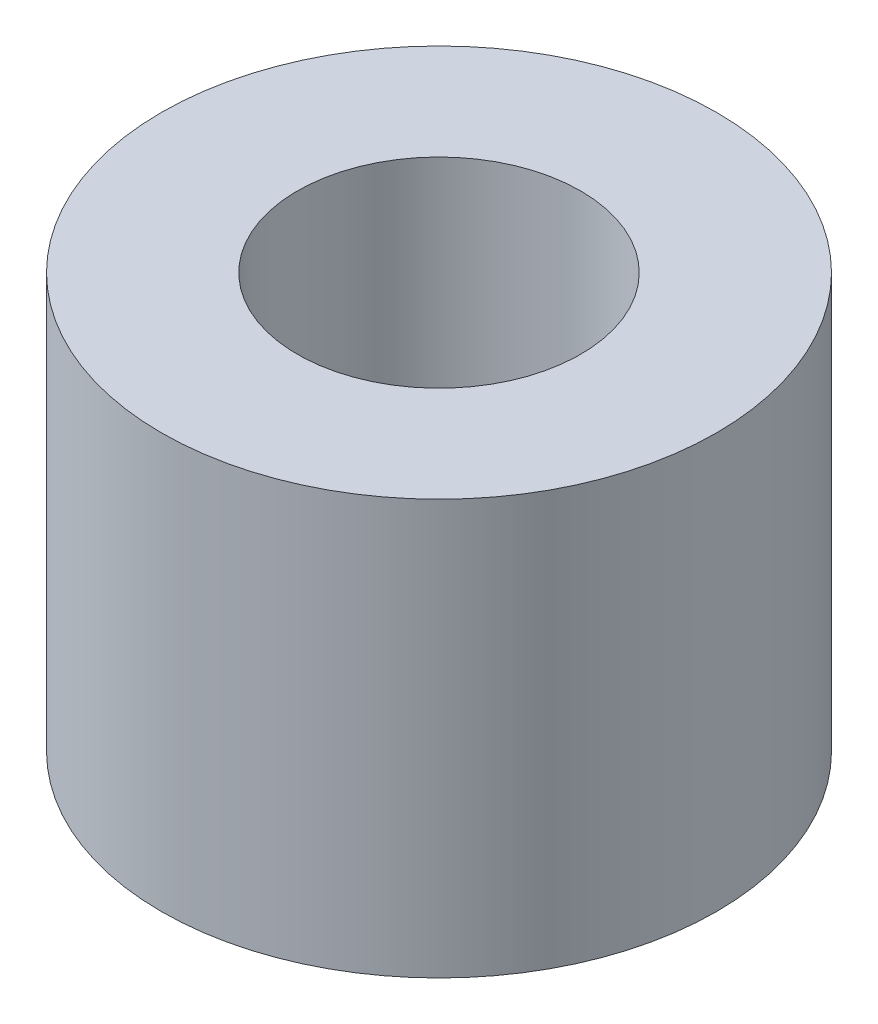
ISO-10303-21;
HEADER;
FILE_DESCRIPTION(('STEP AP214'),'2;1');
FILE_NAME('part.step','',(''),(''),'','','');
FILE_SCHEMA(('AUTOMOTIVE_DESIGN { 1 0 10303 214 1 1 1 1 }'));
ENDSEC;
DATA;
#1=APPLICATION_CONTEXT('core data for automotive mechanical design processes');
#2=APPLICATION_PROTOCOL_DEFINITION('international standard','automotive_design',2000,#1);
#3=PRODUCT_CONTEXT('',#1,'mechanical');
#4=PRODUCT('Part','Part','',(#3));
#5=PRODUCT_RELATED_PRODUCT_CATEGORY('part','',(#4));
#6=PRODUCT_DEFINITION_FORMATION('','',#4);
#7=PRODUCT_DEFINITION_CONTEXT('part definition',#1,'design');
#8=PRODUCT_DEFINITION('design','',#6,#7);
#9=PRODUCT_DEFINITION_SHAPE('','',#8);
#10=(LENGTH_UNIT() NAMED_UNIT(*) SI_UNIT(.MILLI.,.METRE.));
#11=(NAMED_UNIT(*) PLANE_ANGLE_UNIT() SI_UNIT($,.RADIAN.));
#12=(NAMED_UNIT(*) SI_UNIT($,.STERADIAN.) SOLID_ANGLE_UNIT());
#13=UNCERTAINTY_MEASURE_WITH_UNIT(LENGTH_MEASURE(1.E-05),#10,'distance_accuracy_value','');
#14=(GEOMETRIC_REPRESENTATION_CONTEXT(3) GLOBAL_UNCERTAINTY_ASSIGNED_CONTEXT((#13)) GLOBAL_UNIT_ASSIGNED_CONTEXT((#10,
#11,#12)) REPRESENTATION_CONTEXT('',''));
#15=CARTESIAN_POINT('',(0.,0.,0.));
#16=DIRECTION('',(0.,0.,1.));
#17=DIRECTION('',(1.,0.,0.));
#18=AXIS2_PLACEMENT_3D('',#15,#16,#17);
#19=CARTESIAN_POINT('',(0.,9.2964,0.));
#20=DIRECTION('',(0.,1.,0.));
#21=DIRECTION('',(0.,0.,1.));
#22=AXIS2_PLACEMENT_3D('',#19,#20,#21);
#23=PLANE('',#22);
#24=CARTESIAN_POINT('',(0.,9.2964,0.));
#25=DIRECTION('',(0.,1.,0.));
#26=DIRECTION('',(0.,0.,1.));
#27=AXIS2_PLACEMENT_3D('',#24,#25,#26);
#28=CIRCLE('',#27,6.22300000006913);
#29=CARTESIAN_POINT('',(0.,9.2964,-6.22300000006913));
#30=VERTEX_POINT('',#29);
#31=EDGE_CURVE('E10',#30,#30,#28,.T.);
#32=ORIENTED_EDGE('',*,*,#31,.T.);
#33=EDGE_LOOP('',(#32));
#34=FACE_BOUND('',#33,.T.);
#35=CARTESIAN_POINT('',(0.,9.2964,0.));
#36=DIRECTION('',(0.,1.,0.));
#37=DIRECTION('',(0.,0.,1.));
#38=AXIS2_PLACEMENT_3D('',#35,#36,#37);
#39=CIRCLE('',#38,3.17500000006914);
#40=CARTESIAN_POINT('',(0.,9.2964,-3.17500000006914));
#41=VERTEX_POINT('',#40);
#42=EDGE_CURVE('E50',#41,#41,#39,.T.);
#43=ORIENTED_EDGE('',*,*,#42,.F.);
#44=EDGE_LOOP('',(#43));
#45=FACE_BOUND('',#44,.T.);
#46=ADVANCED_FACE('F37',(#34,#45),#23,.T.);
#47=CARTESIAN_POINT('',(0.,0.,0.));
#48=DIRECTION('',(0.,1.,0.));
#49=DIRECTION('',(0.,0.,1.));
#50=AXIS2_PLACEMENT_3D('',#47,#48,#49);
#51=PLANE('',#50);
#52=CARTESIAN_POINT('',(0.,0.,0.));
#53=DIRECTION('',(0.,1.,0.));
#54=DIRECTION('',(0.,0.,1.));
#55=AXIS2_PLACEMENT_3D('',#52,#53,#54);
#56=CIRCLE('',#55,6.22300000006913);
#57=CARTESIAN_POINT('',(0.,0.,-6.22300000006913));
#58=VERTEX_POINT('',#57);
#59=EDGE_CURVE('E41',#58,#58,#56,.T.);
#60=ORIENTED_EDGE('',*,*,#59,.F.);
#61=EDGE_LOOP('',(#60));
#62=FACE_BOUND('',#61,.T.);
#63=CARTESIAN_POINT('',(0.,0.,0.));
#64=DIRECTION('',(0.,1.,0.));
#65=DIRECTION('',(0.,0.,1.));
#66=AXIS2_PLACEMENT_3D('',#63,#64,#65);
#67=CIRCLE('',#66,3.17500000006914);
#68=CARTESIAN_POINT('',(0.,0.,-3.17500000006914));
#69=VERTEX_POINT('',#68);
#70=EDGE_CURVE('E52',#69,#69,#67,.T.);
#71=ORIENTED_EDGE('',*,*,#70,.T.);
#72=EDGE_LOOP('',(#71));
#73=FACE_BOUND('',#72,.T.);
#74=ADVANCED_FACE('F64',(#62,#73),#51,.F.);
#75=CARTESIAN_POINT('',(0.,9.2964,0.));
#76=DIRECTION('',(0.,-1.,0.));
#77=DIRECTION('',(0.,0.,-1.));
#78=AXIS2_PLACEMENT_3D('',#75,#76,#77);
#79=CYLINDRICAL_SURFACE('',#78,6.22300000006913);
#80=CARTESIAN_POINT('',(0.,9.2964,-6.22300000006913));
#81=CARTESIAN_POINT('',(0.,9.1995625,-6.22300000006913));
#82=CARTESIAN_POINT('',(0.,9.102725,-6.22300000006913));
#83=CARTESIAN_POINT('',(0.,8.90905,-6.22300000006913));
#84=CARTESIAN_POINT('',(0.,8.8122125,-6.22300000006913));
#85=CARTESIAN_POINT('',(0.,8.6185375,-6.22300000006913));
#86=CARTESIAN_POINT('',(0.,8.5217,-6.22300000006913));
#87=CARTESIAN_POINT('',(0.,8.328025,-6.22300000006913));
#88=CARTESIAN_POINT('',(0.,8.2311875,-6.22300000006913));
#89=CARTESIAN_POINT('',(0.,8.0375125,-6.22300000006913));
#90=CARTESIAN_POINT('',(0.,7.940675,-6.22300000006913));
#91=CARTESIAN_POINT('',(0.,7.747,-6.22300000006913));
#92=CARTESIAN_POINT('',(0.,7.6501625,-6.22300000006913));
#93=CARTESIAN_POINT('',(0.,7.4564875,-6.22300000006913));
#94=CARTESIAN_POINT('',(0.,7.35965,-6.22300000006913));
#95=CARTESIAN_POINT('',(0.,7.165975,-6.22300000006913));
#96=CARTESIAN_POINT('',(0.,7.0691375,-6.22300000006913));
#97=CARTESIAN_POINT('',(0.,6.8754625,-6.22300000006913));
#98=CARTESIAN_POINT('',(0.,6.778625,-6.22300000006913));
#99=CARTESIAN_POINT('',(0.,6.58495,-6.22300000006913));
#100=CARTESIAN_POINT('',(0.,6.4881125,-6.22300000006913));
#101=CARTESIAN_POINT('',(0.,6.2944375,-6.22300000006913));
#102=CARTESIAN_POINT('',(0.,6.1976,-6.22300000006913));
#103=CARTESIAN_POINT('',(0.,6.003925,-6.22300000006913));
#104=CARTESIAN_POINT('',(0.,5.9070875,-6.22300000006913));
#105=CARTESIAN_POINT('',(0.,5.7134125,-6.22300000006913));
#106=CARTESIAN_POINT('',(0.,5.616575,-6.22300000006913));
#107=CARTESIAN_POINT('',(0.,5.4229,-6.22300000006913));
#108=CARTESIAN_POINT('',(0.,5.3260625,-6.22300000006913));
#109=CARTESIAN_POINT('',(0.,5.1323875,-6.22300000006913));
#110=CARTESIAN_POINT('',(0.,5.03555,-6.22300000006913));
#111=CARTESIAN_POINT('',(0.,4.841875,-6.22300000006913));
#112=CARTESIAN_POINT('',(0.,4.7450375,-6.22300000006913));
#113=CARTESIAN_POINT('',(0.,4.5513625,-6.22300000006913));
#114=CARTESIAN_POINT('',(0.,4.454525,-6.22300000006913));
#115=CARTESIAN_POINT('',(0.,4.26085,-6.22300000006913));
#116=CARTESIAN_POINT('',(0.,4.1640125,-6.22300000006913));
#117=CARTESIAN_POINT('',(0.,3.9703375,-6.22300000006913));
#118=CARTESIAN_POINT('',(0.,3.8735,-6.22300000006913));
#119=CARTESIAN_POINT('',(0.,3.679825,-6.22300000006913));
#120=CARTESIAN_POINT('',(0.,3.5829875,-6.22300000006913));
#121=CARTESIAN_POINT('',(0.,3.3893125,-6.22300000006913));
#122=CARTESIAN_POINT('',(0.,3.292475,-6.22300000006913));
#123=CARTESIAN_POINT('',(0.,3.0988,-6.22300000006913));
#124=CARTESIAN_POINT('',(0.,3.0019625,-6.22300000006913));
#125=CARTESIAN_POINT('',(0.,2.8082875,-6.22300000006913));
#126=CARTESIAN_POINT('',(0.,2.71145,-6.22300000006913));
#127=CARTESIAN_POINT('',(0.,2.517775,-6.22300000006913));
#128=CARTESIAN_POINT('',(0.,2.4209375,-6.22300000006913));
#129=CARTESIAN_POINT('',(0.,2.2272625,-6.22300000006913));
#130=CARTESIAN_POINT('',(0.,2.130425,-6.22300000006913));
#131=CARTESIAN_POINT('',(0.,1.93675,-6.22300000006913));
#132=CARTESIAN_POINT('',(0.,1.8399125,-6.22300000006913));
#133=CARTESIAN_POINT('',(0.,1.6462375,-6.22300000006913));
#134=CARTESIAN_POINT('',(0.,1.5494,-6.22300000006913));
#135=CARTESIAN_POINT('',(0.,1.355725,-6.22300000006913));
#136=CARTESIAN_POINT('',(0.,1.2588875,-6.22300000006913));
#137=CARTESIAN_POINT('',(0.,1.0652125,-6.22300000006913));
#138=CARTESIAN_POINT('',(0.,0.968374999999999,-6.22300000006913));
#139=CARTESIAN_POINT('',(0.,0.774699999999999,-6.22300000006913));
#140=CARTESIAN_POINT('',(0.,0.677862499999999,-6.22300000006913));
#141=CARTESIAN_POINT('',(0.,0.484187499999998,-6.22300000006913));
#142=CARTESIAN_POINT('',(0.,0.387349999999998,-6.22300000006913));
#143=CARTESIAN_POINT('',(0.,0.193674999999998,-6.22300000006913));
#144=CARTESIAN_POINT('',(0.,0.096837499999998,-6.22300000006913));
#145=CARTESIAN_POINT('',(0.,0.,-6.22300000006913));
#146=B_SPLINE_CURVE_WITH_KNOTS('',3,(#80,#81,#82,#83,#84,#85,#86,#87,#88,#89,#90,#91,#92,#93,
#94,#95,#96,#97,#98,#99,#100,#101,#102,#103,#104,#105,#106,#107,#108,#109,#110,#111,#112,#113,
#114,#115,#116,#117,#118,#119,#120,#121,#122,#123,#124,#125,#126,#127,#128,#129,#130,#131,#132,
#133,#134,#135,#136,#137,#138,#139,#140,#141,#142,#143,#144,#145),.UNSPECIFIED.,.F.,.F.,(4,2,2,
2,2,2,2,2,2,2,2,2,2,2,2,2,2,2,2,2,2,2,2,2,2,2,2,2,2,2,2,2,4),(0.,0.290512500000001,
0.581025000000001,0.871537500000002,1.16205,1.4525625,1.743075,2.0335875,2.3241,2.6146125,
2.905125,3.1956375,3.48615,3.7766625,4.067175,4.3576875,4.6482,4.9387125,5.229225,5.5197375,
5.81025,6.1007625,6.391275,6.6817875,6.9723,7.2628125,7.553325,7.8438375,8.13435,8.4248625,
8.715375,9.0058875,9.2964),.UNSPECIFIED.);
#147=EDGE_CURVE('BSEAM39',#30,#58,#146,.T.);
#148=ORIENTED_EDGE('',*,*,#31,.F.);
#149=ORIENTED_EDGE('',*,*,#59,.T.);
#150=ORIENTED_EDGE('',*,*,#147,.T.);
#151=ORIENTED_EDGE('',*,*,#147,.F.);
#152=EDGE_LOOP('',(#148,#150,#149,#151));
#153=FACE_BOUND('',#152,.T.);
#154=ADVANCED_FACE('F39',(#153),#79,.T.);
#155=CARTESIAN_POINT('',(0.,9.2964,0.));
#156=DIRECTION('',(0.,-1.,0.));
#157=DIRECTION('',(0.,0.,-1.));
#158=AXIS2_PLACEMENT_3D('',#155,#156,#157);
#159=CYLINDRICAL_SURFACE('',#158,3.17500000006914);
#160=CARTESIAN_POINT('',(0.,9.2964,-3.17500000006914));
#161=CARTESIAN_POINT('',(0.,9.1995625,-3.17500000006914));
#162=CARTESIAN_POINT('',(0.,9.102725,-3.17500000006914));
#163=CARTESIAN_POINT('',(0.,8.90905,-3.17500000006914));
#164=CARTESIAN_POINT('',(0.,8.8122125,-3.17500000006914));
#165=CARTESIAN_POINT('',(0.,8.6185375,-3.17500000006914));
#166=CARTESIAN_POINT('',(0.,8.5217,-3.17500000006914));
#167=CARTESIAN_POINT('',(0.,8.328025,-3.17500000006914));
#168=CARTESIAN_POINT('',(0.,8.2311875,-3.17500000006914));
#169=CARTESIAN_POINT('',(0.,8.0375125,-3.17500000006914));
#170=CARTESIAN_POINT('',(0.,7.940675,-3.17500000006914));
#171=CARTESIAN_POINT('',(0.,7.747,-3.17500000006914));
#172=CARTESIAN_POINT('',(0.,7.6501625,-3.17500000006914));
#173=CARTESIAN_POINT('',(0.,7.4564875,-3.17500000006914));
#174=CARTESIAN_POINT('',(0.,7.35965,-3.17500000006914));
#175=CARTESIAN_POINT('',(0.,7.165975,-3.17500000006914));
#176=CARTESIAN_POINT('',(0.,7.0691375,-3.17500000006914));
#177=CARTESIAN_POINT('',(0.,6.8754625,-3.17500000006914));
#178=CARTESIAN_POINT('',(0.,6.778625,-3.17500000006914));
#179=CARTESIAN_POINT('',(0.,6.58495,-3.17500000006914));
#180=CARTESIAN_POINT('',(0.,6.4881125,-3.17500000006914));
#181=CARTESIAN_POINT('',(0.,6.2944375,-3.17500000006914));
#182=CARTESIAN_POINT('',(0.,6.1976,-3.17500000006914));
#183=CARTESIAN_POINT('',(0.,6.003925,-3.17500000006914));
#184=CARTESIAN_POINT('',(0.,5.9070875,-3.17500000006914));
#185=CARTESIAN_POINT('',(0.,5.7134125,-3.17500000006914));
#186=CARTESIAN_POINT('',(0.,5.616575,-3.17500000006914));
#187=CARTESIAN_POINT('',(0.,5.4229,-3.17500000006914));
#188=CARTESIAN_POINT('',(0.,5.3260625,-3.17500000006914));
#189=CARTESIAN_POINT('',(0.,5.1323875,-3.17500000006914));
#190=CARTESIAN_POINT('',(0.,5.03555,-3.17500000006914));
#191=CARTESIAN_POINT('',(0.,4.841875,-3.17500000006914));
#192=CARTESIAN_POINT('',(0.,4.7450375,-3.17500000006914));
#193=CARTESIAN_POINT('',(0.,4.5513625,-3.17500000006914));
#194=CARTESIAN_POINT('',(0.,4.454525,-3.17500000006914));
#195=CARTESIAN_POINT('',(0.,4.26085,-3.17500000006914));
#196=CARTESIAN_POINT('',(0.,4.1640125,-3.17500000006914));
#197=CARTESIAN_POINT('',(0.,3.9703375,-3.17500000006914));
#198=CARTESIAN_POINT('',(0.,3.8735,-3.17500000006914));
#199=CARTESIAN_POINT('',(0.,3.679825,-3.17500000006914));
#200=CARTESIAN_POINT('',(0.,3.5829875,-3.17500000006914));
#201=CARTESIAN_POINT('',(0.,3.3893125,-3.17500000006914));
#202=CARTESIAN_POINT('',(0.,3.292475,-3.17500000006914));
#203=CARTESIAN_POINT('',(0.,3.0988,-3.17500000006914));
#204=CARTESIAN_POINT('',(0.,3.0019625,-3.17500000006914));
#205=CARTESIAN_POINT('',(0.,2.8082875,-3.17500000006914));
#206=CARTESIAN_POINT('',(0.,2.71145,-3.17500000006914));
#207=CARTESIAN_POINT('',(0.,2.517775,-3.17500000006914));
#208=CARTESIAN_POINT('',(0.,2.4209375,-3.17500000006914));
#209=CARTESIAN_POINT('',(0.,2.2272625,-3.17500000006914));
#210=CARTESIAN_POINT('',(0.,2.130425,-3.17500000006914));
#211=CARTESIAN_POINT('',(0.,1.93675,-3.17500000006914));
#212=CARTESIAN_POINT('',(0.,1.8399125,-3.17500000006914));
#213=CARTESIAN_POINT('',(0.,1.6462375,-3.17500000006914));
#214=CARTESIAN_POINT('',(0.,1.5494,-3.17500000006914));
#215=CARTESIAN_POINT('',(0.,1.355725,-3.17500000006914));
#216=CARTESIAN_POINT('',(0.,1.2588875,-3.17500000006914));
#217=CARTESIAN_POINT('',(0.,1.0652125,-3.17500000006914));
#218=CARTESIAN_POINT('',(0.,0.968374999999999,-3.17500000006914));
#219=CARTESIAN_POINT('',(0.,0.774699999999999,-3.17500000006914));
#220=CARTESIAN_POINT('',(0.,0.677862499999999,-3.17500000006914));
#221=CARTESIAN_POINT('',(0.,0.484187499999998,-3.17500000006914));
#222=CARTESIAN_POINT('',(0.,0.387349999999998,-3.17500000006914));
#223=CARTESIAN_POINT('',(0.,0.193674999999998,-3.17500000006914));
#224=CARTESIAN_POINT('',(0.,0.096837499999998,-3.17500000006914));
#225=CARTESIAN_POINT('',(0.,0.,-3.17500000006914));
#226=B_SPLINE_CURVE_WITH_KNOTS('',3,(#160,#161,#162,#163,#164,#165,#166,#167,#168,#169,#170,
#171,#172,#173,#174,#175,#176,#177,#178,#179,#180,#181,#182,#183,#184,#185,#186,#187,#188,#189,
#190,#191,#192,#193,#194,#195,#196,#197,#198,#199,#200,#201,#202,#203,#204,#205,#206,#207,#208,
#209,#210,#211,#212,#213,#214,#215,#216,#217,#218,#219,#220,#221,#222,#223,#224,#225),
.UNSPECIFIED.,.F.,.F.,(4,2,2,2,2,2,2,2,2,2,2,2,2,2,2,2,2,2,2,2,2,2,2,2,2,2,2,2,2,2,2,2,4),(0.,
0.290512500000001,0.581025000000001,0.871537500000002,1.16205,1.4525625,1.743075,2.0335875,
2.3241,2.6146125,2.905125,3.1956375,3.48615,3.7766625,4.067175,4.3576875,4.6482,4.9387125,
5.229225,5.5197375,5.81025,6.1007625,6.391275,6.6817875,6.9723,7.2628125,7.553325,7.8438375,
8.13435,8.4248625,8.715375,9.0058875,9.2964),.UNSPECIFIED.);
#227=EDGE_CURVE('BSEAM60',#41,#69,#226,.T.);
#228=ORIENTED_EDGE('',*,*,#42,.T.);
#229=ORIENTED_EDGE('',*,*,#70,.F.);
#230=ORIENTED_EDGE('',*,*,#227,.T.);
#231=ORIENTED_EDGE('',*,*,#227,.F.);
#232=EDGE_LOOP('',(#228,#230,#229,#231));
#233=FACE_BOUND('',#232,.T.);
#234=ADVANCED_FACE('F60',(#233),#159,.F.);
#235=CLOSED_SHELL('',(#46,#74,#154,#234));
#236=MANIFOLD_SOLID_BREP('B2',#235);
#237=ADVANCED_BREP_SHAPE_REPRESENTATION('',(#18,#236),#14);
#238=SHAPE_DEFINITION_REPRESENTATION(#9,#237);
ENDSEC;
END-ISO-10303-21;
